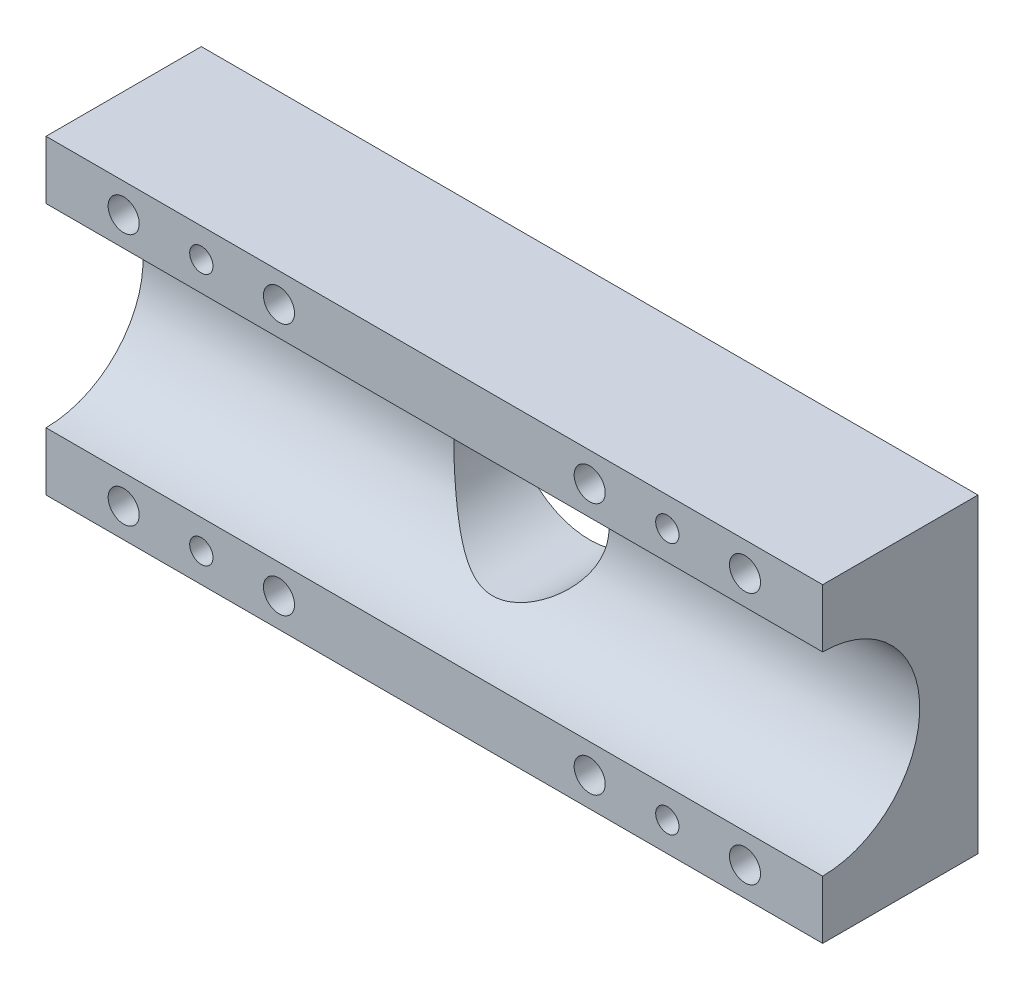
ISO-10303-21;
HEADER;
FILE_DESCRIPTION(('STEP AP214'),'2;1');
FILE_NAME('part.step','',(''),(''),'','','');
FILE_SCHEMA(('AUTOMOTIVE_DESIGN { 1 0 10303 214 1 1 1 1 }'));
ENDSEC;
DATA;
#1=APPLICATION_CONTEXT('core data for automotive mechanical design processes');
#2=APPLICATION_PROTOCOL_DEFINITION('international standard','automotive_design',2000,#1);
#3=PRODUCT_CONTEXT('',#1,'mechanical');
#4=PRODUCT('Part','Part','',(#3));
#5=PRODUCT_RELATED_PRODUCT_CATEGORY('part','',(#4));
#6=PRODUCT_DEFINITION_FORMATION('','',#4);
#7=PRODUCT_DEFINITION_CONTEXT('part definition',#1,'design');
#8=PRODUCT_DEFINITION('design','',#6,#7);
#9=PRODUCT_DEFINITION_SHAPE('','',#8);
#10=(LENGTH_UNIT() NAMED_UNIT(*) SI_UNIT(.MILLI.,.METRE.));
#11=(NAMED_UNIT(*) PLANE_ANGLE_UNIT() SI_UNIT($,.RADIAN.));
#12=(NAMED_UNIT(*) SI_UNIT($,.STERADIAN.) SOLID_ANGLE_UNIT());
#13=UNCERTAINTY_MEASURE_WITH_UNIT(LENGTH_MEASURE(1.E-05),#10,'distance_accuracy_value','');
#14=(GEOMETRIC_REPRESENTATION_CONTEXT(3) GLOBAL_UNCERTAINTY_ASSIGNED_CONTEXT((#13)) GLOBAL_UNIT_ASSIGNED_CONTEXT((#10,
#11,#12)) REPRESENTATION_CONTEXT('',''));
#15=CARTESIAN_POINT('',(0.,0.,0.));
#16=DIRECTION('',(0.,0.,1.));
#17=DIRECTION('',(1.,0.,0.));
#18=AXIS2_PLACEMENT_3D('',#15,#16,#17);
#19=CARTESIAN_POINT('',(0.,0.,20.));
#20=DIRECTION('',(0.,0.,1.));
#21=DIRECTION('',(1.,0.,0.));
#22=AXIS2_PLACEMENT_3D('',#19,#20,#21);
#23=PLANE('',#22);
#24=CARTESIAN_POINT('',(-40.,-16.25,20.));
#25=DIRECTION('',(0.,0.,1.));
#26=DIRECTION('',(1.,0.,0.));
#27=AXIS2_PLACEMENT_3D('',#24,#25,#26);
#28=CIRCLE('',#27,2.);
#29=CARTESIAN_POINT('',(-38.,-16.25,20.));
#30=VERTEX_POINT('',#29);
#31=EDGE_CURVE('E268',#30,#30,#28,.T.);
#32=ORIENTED_EDGE('',*,*,#31,.F.);
#33=EDGE_LOOP('',(#32));
#34=FACE_BOUND('',#33,.T.);
#35=CARTESIAN_POINT('',(-30.,-16.25,20.));
#36=DIRECTION('',(0.,0.,1.));
#37=DIRECTION('',(1.,0.,0.));
#38=AXIS2_PLACEMENT_3D('',#35,#36,#37);
#39=CIRCLE('',#38,1.5);
#40=CARTESIAN_POINT('',(-28.5,-16.25,20.));
#41=VERTEX_POINT('',#40);
#42=EDGE_CURVE('E264',#41,#41,#39,.T.);
#43=ORIENTED_EDGE('',*,*,#42,.F.);
#44=EDGE_LOOP('',(#43));
#45=FACE_BOUND('',#44,.T.);
#46=CARTESIAN_POINT('',(-20.,-16.25,20.));
#47=DIRECTION('',(0.,0.,1.));
#48=DIRECTION('',(1.,0.,0.));
#49=AXIS2_PLACEMENT_3D('',#46,#47,#48);
#50=CIRCLE('',#49,2.);
#51=CARTESIAN_POINT('',(-18.,-16.25,20.));
#52=VERTEX_POINT('',#51);
#53=EDGE_CURVE('E260',#52,#52,#50,.T.);
#54=ORIENTED_EDGE('',*,*,#53,.F.);
#55=EDGE_LOOP('',(#54));
#56=FACE_BOUND('',#55,.T.);
#57=CARTESIAN_POINT('',(20.,-16.25,20.));
#58=DIRECTION('',(0.,0.,1.));
#59=DIRECTION('',(1.,0.,0.));
#60=AXIS2_PLACEMENT_3D('',#57,#58,#59);
#61=CIRCLE('',#60,2.);
#62=CARTESIAN_POINT('',(22.,-16.25,20.));
#63=VERTEX_POINT('',#62);
#64=EDGE_CURVE('E256',#63,#63,#61,.T.);
#65=ORIENTED_EDGE('',*,*,#64,.F.);
#66=EDGE_LOOP('',(#65));
#67=FACE_BOUND('',#66,.T.);
#68=CARTESIAN_POINT('',(30.,-16.25,20.));
#69=DIRECTION('',(0.,0.,1.));
#70=DIRECTION('',(1.,0.,0.));
#71=AXIS2_PLACEMENT_3D('',#68,#69,#70);
#72=CIRCLE('',#71,1.5);
#73=CARTESIAN_POINT('',(31.5,-16.25,20.));
#74=VERTEX_POINT('',#73);
#75=EDGE_CURVE('E252',#74,#74,#72,.T.);
#76=ORIENTED_EDGE('',*,*,#75,.F.);
#77=EDGE_LOOP('',(#76));
#78=FACE_BOUND('',#77,.T.);
#79=CARTESIAN_POINT('',(40.,-16.25,20.));
#80=DIRECTION('',(0.,0.,1.));
#81=DIRECTION('',(1.,0.,0.));
#82=AXIS2_PLACEMENT_3D('',#79,#80,#81);
#83=CIRCLE('',#82,2.);
#84=CARTESIAN_POINT('',(42.,-16.25,20.));
#85=VERTEX_POINT('',#84);
#86=EDGE_CURVE('E248',#85,#85,#83,.T.);
#87=ORIENTED_EDGE('',*,*,#86,.F.);
#88=EDGE_LOOP('',(#87));
#89=FACE_BOUND('',#88,.T.);
#90=DIRECTION('',(1.,0.,0.));
#91=VECTOR('',#90,1.);
#92=CARTESIAN_POINT('',(-50.,-12.5,20.));
#93=LINE('',#92,#91);
#94=CARTESIAN_POINT('',(-50.,-12.5,20.));
#95=VERTEX_POINT('',#94);
#96=CARTESIAN_POINT('',(50.,-12.5,20.));
#97=VERTEX_POINT('',#96);
#98=EDGE_CURVE('E11',#95,#97,#93,.T.);
#99=ORIENTED_EDGE('',*,*,#98,.F.);
#100=DIRECTION('',(0.,-1.,0.));
#101=VECTOR('',#100,1.);
#102=CARTESIAN_POINT('',(-50.,20.,20.));
#103=LINE('',#102,#101);
#104=CARTESIAN_POINT('',(-50.,-20.,20.));
#105=VERTEX_POINT('',#104);
#106=EDGE_CURVE('E109',#95,#105,#103,.T.);
#107=ORIENTED_EDGE('',*,*,#106,.T.);
#108=DIRECTION('',(1.,0.,0.));
#109=VECTOR('',#108,1.);
#110=CARTESIAN_POINT('',(-50.,-20.,20.));
#111=LINE('',#110,#109);
#112=CARTESIAN_POINT('',(50.,-20.,20.));
#113=VERTEX_POINT('',#112);
#114=EDGE_CURVE('E60',#105,#113,#111,.T.);
#115=ORIENTED_EDGE('',*,*,#114,.T.);
#116=DIRECTION('',(0.,1.,0.));
#117=VECTOR('',#116,1.);
#118=CARTESIAN_POINT('',(50.,20.,20.));
#119=LINE('',#118,#117);
#120=EDGE_CURVE('E103',#113,#97,#119,.T.);
#121=ORIENTED_EDGE('',*,*,#120,.T.);
#122=EDGE_LOOP('',(#99,#107,#115,#121));
#123=FACE_BOUND('',#122,.T.);
#124=ADVANCED_FACE('F32',(#34,#45,#56,#67,#78,#89,#123),#23,.T.);
#125=CARTESIAN_POINT('',(50.,20.,20.));
#126=DIRECTION('',(-1.,0.,0.));
#127=DIRECTION('',(0.,-1.,0.));
#128=AXIS2_PLACEMENT_3D('',#125,#126,#127);
#129=PLANE('',#128);
#130=CARTESIAN_POINT('',(50.,12.5,20.));
#131=VERTEX_POINT('',#130);
#132=CARTESIAN_POINT('',(50.,20.,20.));
#133=VERTEX_POINT('',#132);
#134=EDGE_CURVE('E88',#131,#133,#119,.T.);
#135=ORIENTED_EDGE('',*,*,#134,.F.);
#136=CARTESIAN_POINT('',(50.,0.,20.));
#137=DIRECTION('',(1.,0.,0.));
#138=DIRECTION('',(0.,1.,0.));
#139=AXIS2_PLACEMENT_3D('',#136,#137,#138);
#140=CIRCLE('',#139,12.5);
#141=EDGE_CURVE('E51',#97,#131,#140,.T.);
#142=ORIENTED_EDGE('',*,*,#141,.F.);
#143=ORIENTED_EDGE('',*,*,#120,.F.);
#144=DIRECTION('',(0.,0.,-1.));
#145=VECTOR('',#144,1.);
#146=CARTESIAN_POINT('',(50.,-20.,20.));
#147=LINE('',#146,#145);
#148=CARTESIAN_POINT('',(50.,-20.,0.));
#149=VERTEX_POINT('',#148);
#150=EDGE_CURVE('E117',#113,#149,#147,.T.);
#151=ORIENTED_EDGE('',*,*,#150,.T.);
#152=DIRECTION('',(0.,1.,0.));
#153=VECTOR('',#152,1.);
#154=CARTESIAN_POINT('',(50.,20.,0.));
#155=LINE('',#154,#153);
#156=CARTESIAN_POINT('',(50.,20.,0.));
#157=VERTEX_POINT('',#156);
#158=EDGE_CURVE('E118',#149,#157,#155,.T.);
#159=ORIENTED_EDGE('',*,*,#158,.T.);
#160=DIRECTION('',(0.,0.,-1.));
#161=VECTOR('',#160,1.);
#162=CARTESIAN_POINT('',(50.,20.,20.));
#163=LINE('',#162,#161);
#164=EDGE_CURVE('E132',#133,#157,#163,.T.);
#165=ORIENTED_EDGE('',*,*,#164,.F.);
#166=EDGE_LOOP('',(#135,#142,#143,#151,#159,#165));
#167=FACE_BOUND('',#166,.T.);
#168=ADVANCED_FACE('F34',(#167),#129,.F.);
#169=CARTESIAN_POINT('',(-50.,20.,20.));
#170=DIRECTION('',(0.,-1.,0.));
#171=DIRECTION('',(0.,0.,-1.));
#172=AXIS2_PLACEMENT_3D('',#169,#170,#171);
#173=PLANE('',#172);
#174=DIRECTION('',(-1.,0.,0.));
#175=VECTOR('',#174,1.);
#176=CARTESIAN_POINT('',(-50.,20.,0.));
#177=LINE('',#176,#175);
#178=CARTESIAN_POINT('',(-50.,20.,0.));
#179=VERTEX_POINT('',#178);
#180=EDGE_CURVE('E121',#157,#179,#177,.T.);
#181=ORIENTED_EDGE('',*,*,#180,.T.);
#182=DIRECTION('',(0.,0.,-1.));
#183=VECTOR('',#182,1.);
#184=CARTESIAN_POINT('',(-50.,20.,20.));
#185=LINE('',#184,#183);
#186=CARTESIAN_POINT('',(-50.,20.,20.));
#187=VERTEX_POINT('',#186);
#188=EDGE_CURVE('E129',#187,#179,#185,.T.);
#189=ORIENTED_EDGE('',*,*,#188,.F.);
#190=DIRECTION('',(-1.,0.,0.));
#191=VECTOR('',#190,1.);
#192=CARTESIAN_POINT('',(-50.,20.,20.));
#193=LINE('',#192,#191);
#194=EDGE_CURVE('E107',#133,#187,#193,.T.);
#195=ORIENTED_EDGE('',*,*,#194,.F.);
#196=ORIENTED_EDGE('',*,*,#164,.T.);
#197=EDGE_LOOP('',(#181,#189,#195,#196));
#198=FACE_BOUND('',#197,.T.);
#199=ADVANCED_FACE('F142',(#198),#173,.F.);
#200=CARTESIAN_POINT('',(-50.,20.,20.));
#201=DIRECTION('',(1.,0.,0.));
#202=DIRECTION('',(0.,1.,0.));
#203=AXIS2_PLACEMENT_3D('',#200,#201,#202);
#204=PLANE('',#203);
#205=ORIENTED_EDGE('',*,*,#106,.F.);
#206=CARTESIAN_POINT('',(-50.,0.,20.));
#207=DIRECTION('',(1.,0.,0.));
#208=DIRECTION('',(0.,1.,0.));
#209=AXIS2_PLACEMENT_3D('',#206,#207,#208);
#210=CIRCLE('',#209,12.5);
#211=CARTESIAN_POINT('',(-50.,12.5,20.));
#212=VERTEX_POINT('',#211);
#213=EDGE_CURVE('E99',#95,#212,#210,.T.);
#214=ORIENTED_EDGE('',*,*,#213,.T.);
#215=EDGE_CURVE('E113',#187,#212,#103,.T.);
#216=ORIENTED_EDGE('',*,*,#215,.F.);
#217=ORIENTED_EDGE('',*,*,#188,.T.);
#218=DIRECTION('',(0.,-1.,0.));
#219=VECTOR('',#218,1.);
#220=CARTESIAN_POINT('',(-50.,20.,0.));
#221=LINE('',#220,#219);
#222=CARTESIAN_POINT('',(-50.,-20.,0.));
#223=VERTEX_POINT('',#222);
#224=EDGE_CURVE('E123',#179,#223,#221,.T.);
#225=ORIENTED_EDGE('',*,*,#224,.T.);
#226=DIRECTION('',(0.,0.,-1.));
#227=VECTOR('',#226,1.);
#228=CARTESIAN_POINT('',(-50.,-20.,20.));
#229=LINE('',#228,#227);
#230=EDGE_CURVE('E127',#105,#223,#229,.T.);
#231=ORIENTED_EDGE('',*,*,#230,.F.);
#232=EDGE_LOOP('',(#205,#214,#216,#217,#225,#231));
#233=FACE_BOUND('',#232,.T.);
#234=ADVANCED_FACE('F137',(#233),#204,.F.);
#235=CARTESIAN_POINT('',(-50.,-20.,20.));
#236=DIRECTION('',(0.,1.,0.));
#237=DIRECTION('',(0.,0.,1.));
#238=AXIS2_PLACEMENT_3D('',#235,#236,#237);
#239=PLANE('',#238);
#240=DIRECTION('',(1.,0.,0.));
#241=VECTOR('',#240,1.);
#242=CARTESIAN_POINT('',(-50.,-20.,0.));
#243=LINE('',#242,#241);
#244=EDGE_CURVE('E81',#223,#149,#243,.T.);
#245=ORIENTED_EDGE('',*,*,#244,.T.);
#246=ORIENTED_EDGE('',*,*,#150,.F.);
#247=ORIENTED_EDGE('',*,*,#114,.F.);
#248=ORIENTED_EDGE('',*,*,#230,.T.);
#249=EDGE_LOOP('',(#245,#246,#247,#248));
#250=FACE_BOUND('',#249,.T.);
#251=ADVANCED_FACE('F147',(#250),#239,.F.);
#252=CARTESIAN_POINT('',(40.,16.25,20.));
#253=DIRECTION('',(0.,0.,1.));
#254=DIRECTION('',(1.,0.,0.));
#255=AXIS2_PLACEMENT_3D('',#252,#253,#254);
#256=CIRCLE('',#255,2.);
#257=CARTESIAN_POINT('',(42.,16.25,20.));
#258=VERTEX_POINT('',#257);
#259=EDGE_CURVE('E244',#258,#258,#256,.T.);
#260=ORIENTED_EDGE('',*,*,#259,.F.);
#261=EDGE_LOOP('',(#260));
#262=FACE_BOUND('',#261,.T.);
#263=CARTESIAN_POINT('',(30.,16.25,20.));
#264=DIRECTION('',(0.,0.,1.));
#265=DIRECTION('',(1.,0.,0.));
#266=AXIS2_PLACEMENT_3D('',#263,#264,#265);
#267=CIRCLE('',#266,1.5);
#268=CARTESIAN_POINT('',(31.5,16.25,20.));
#269=VERTEX_POINT('',#268);
#270=EDGE_CURVE('E240',#269,#269,#267,.T.);
#271=ORIENTED_EDGE('',*,*,#270,.F.);
#272=EDGE_LOOP('',(#271));
#273=FACE_BOUND('',#272,.T.);
#274=CARTESIAN_POINT('',(20.,16.25,20.));
#275=DIRECTION('',(0.,0.,1.));
#276=DIRECTION('',(1.,0.,0.));
#277=AXIS2_PLACEMENT_3D('',#274,#275,#276);
#278=CIRCLE('',#277,2.00000000000001);
#279=CARTESIAN_POINT('',(22.,16.25,20.));
#280=VERTEX_POINT('',#279);
#281=EDGE_CURVE('E236',#280,#280,#278,.T.);
#282=ORIENTED_EDGE('',*,*,#281,.F.);
#283=EDGE_LOOP('',(#282));
#284=FACE_BOUND('',#283,.T.);
#285=CARTESIAN_POINT('',(-20.,16.25,20.));
#286=DIRECTION('',(0.,0.,1.));
#287=DIRECTION('',(1.,0.,0.));
#288=AXIS2_PLACEMENT_3D('',#285,#286,#287);
#289=CIRCLE('',#288,2.);
#290=CARTESIAN_POINT('',(-18.,16.25,20.));
#291=VERTEX_POINT('',#290);
#292=EDGE_CURVE('E232',#291,#291,#289,.T.);
#293=ORIENTED_EDGE('',*,*,#292,.F.);
#294=EDGE_LOOP('',(#293));
#295=FACE_BOUND('',#294,.T.);
#296=CARTESIAN_POINT('',(-30.,16.25,20.));
#297=DIRECTION('',(0.,0.,1.));
#298=DIRECTION('',(1.,0.,0.));
#299=AXIS2_PLACEMENT_3D('',#296,#297,#298);
#300=CIRCLE('',#299,1.5);
#301=CARTESIAN_POINT('',(-28.5,16.25,20.));
#302=VERTEX_POINT('',#301);
#303=EDGE_CURVE('E228',#302,#302,#300,.T.);
#304=ORIENTED_EDGE('',*,*,#303,.F.);
#305=EDGE_LOOP('',(#304));
#306=FACE_BOUND('',#305,.T.);
#307=CARTESIAN_POINT('',(-40.,16.25,20.));
#308=DIRECTION('',(0.,0.,1.));
#309=DIRECTION('',(1.,0.,0.));
#310=AXIS2_PLACEMENT_3D('',#307,#308,#309);
#311=CIRCLE('',#310,2.);
#312=CARTESIAN_POINT('',(-38.,16.25,20.));
#313=VERTEX_POINT('',#312);
#314=EDGE_CURVE('E225',#313,#313,#311,.T.);
#315=ORIENTED_EDGE('',*,*,#314,.F.);
#316=EDGE_LOOP('',(#315));
#317=FACE_BOUND('',#316,.T.);
#318=DIRECTION('',(1.,0.,0.));
#319=VECTOR('',#318,1.);
#320=CARTESIAN_POINT('',(-50.,12.5,20.));
#321=LINE('',#320,#319);
#322=EDGE_CURVE('E45',#131,#212,#321,.F.);
#323=ORIENTED_EDGE('',*,*,#322,.F.);
#324=ORIENTED_EDGE('',*,*,#134,.T.);
#325=ORIENTED_EDGE('',*,*,#194,.T.);
#326=ORIENTED_EDGE('',*,*,#215,.T.);
#327=EDGE_LOOP('',(#323,#324,#325,#326));
#328=FACE_BOUND('',#327,.T.);
#329=ADVANCED_FACE('F139',(#262,#273,#284,#295,#306,#317,#328),#23,.T.);
#330=CARTESIAN_POINT('',(0.,0.,0.));
#331=DIRECTION('',(0.,0.,1.));
#332=DIRECTION('',(1.,0.,0.));
#333=AXIS2_PLACEMENT_3D('',#330,#331,#332);
#334=PLANE('',#333);
#335=CARTESIAN_POINT('',(0.,0.,0.));
#336=DIRECTION('',(0.,0.,-1.));
#337=DIRECTION('',(-1.,0.,0.));
#338=AXIS2_PLACEMENT_3D('',#335,#336,#337);
#339=CIRCLE('',#338,10.);
#340=CARTESIAN_POINT('',(-10.,0.,0.));
#341=VERTEX_POINT('',#340);
#342=EDGE_CURVE('E177',#341,#341,#339,.T.);
#343=ORIENTED_EDGE('',*,*,#342,.F.);
#344=EDGE_LOOP('',(#343));
#345=FACE_BOUND('',#344,.T.);
#346=CARTESIAN_POINT('',(-40.,-16.25,0.));
#347=DIRECTION('',(0.,0.,1.));
#348=DIRECTION('',(1.,0.,0.));
#349=AXIS2_PLACEMENT_3D('',#346,#347,#348);
#350=CIRCLE('',#349,2.);
#351=CARTESIAN_POINT('',(-38.,-16.25,0.));
#352=VERTEX_POINT('',#351);
#353=EDGE_CURVE('E181',#352,#352,#350,.T.);
#354=ORIENTED_EDGE('',*,*,#353,.T.);
#355=EDGE_LOOP('',(#354));
#356=FACE_BOUND('',#355,.T.);
#357=CARTESIAN_POINT('',(-30.,-16.25,0.));
#358=DIRECTION('',(0.,0.,1.));
#359=DIRECTION('',(1.,0.,0.));
#360=AXIS2_PLACEMENT_3D('',#357,#358,#359);
#361=CIRCLE('',#360,1.5);
#362=CARTESIAN_POINT('',(-28.5,-16.25,0.));
#363=VERTEX_POINT('',#362);
#364=EDGE_CURVE('E185',#363,#363,#361,.T.);
#365=ORIENTED_EDGE('',*,*,#364,.T.);
#366=EDGE_LOOP('',(#365));
#367=FACE_BOUND('',#366,.T.);
#368=CARTESIAN_POINT('',(-20.,-16.25,0.));
#369=DIRECTION('',(0.,0.,1.));
#370=DIRECTION('',(1.,0.,0.));
#371=AXIS2_PLACEMENT_3D('',#368,#369,#370);
#372=CIRCLE('',#371,2.);
#373=CARTESIAN_POINT('',(-18.,-16.25,0.));
#374=VERTEX_POINT('',#373);
#375=EDGE_CURVE('E189',#374,#374,#372,.T.);
#376=ORIENTED_EDGE('',*,*,#375,.T.);
#377=EDGE_LOOP('',(#376));
#378=FACE_BOUND('',#377,.T.);
#379=CARTESIAN_POINT('',(20.,-16.25,0.));
#380=DIRECTION('',(0.,0.,1.));
#381=DIRECTION('',(1.,0.,0.));
#382=AXIS2_PLACEMENT_3D('',#379,#380,#381);
#383=CIRCLE('',#382,2.);
#384=CARTESIAN_POINT('',(22.,-16.25,0.));
#385=VERTEX_POINT('',#384);
#386=EDGE_CURVE('E193',#385,#385,#383,.T.);
#387=ORIENTED_EDGE('',*,*,#386,.T.);
#388=EDGE_LOOP('',(#387));
#389=FACE_BOUND('',#388,.T.);
#390=CARTESIAN_POINT('',(30.,-16.25,0.));
#391=DIRECTION('',(0.,0.,1.));
#392=DIRECTION('',(1.,0.,0.));
#393=AXIS2_PLACEMENT_3D('',#390,#391,#392);
#394=CIRCLE('',#393,1.5);
#395=CARTESIAN_POINT('',(31.5,-16.25,0.));
#396=VERTEX_POINT('',#395);
#397=EDGE_CURVE('E197',#396,#396,#394,.T.);
#398=ORIENTED_EDGE('',*,*,#397,.T.);
#399=EDGE_LOOP('',(#398));
#400=FACE_BOUND('',#399,.T.);
#401=CARTESIAN_POINT('',(40.,-16.25,0.));
#402=DIRECTION('',(0.,0.,1.));
#403=DIRECTION('',(1.,0.,0.));
#404=AXIS2_PLACEMENT_3D('',#401,#402,#403);
#405=CIRCLE('',#404,2.);
#406=CARTESIAN_POINT('',(42.,-16.25,0.));
#407=VERTEX_POINT('',#406);
#408=EDGE_CURVE('E201',#407,#407,#405,.T.);
#409=ORIENTED_EDGE('',*,*,#408,.T.);
#410=EDGE_LOOP('',(#409));
#411=FACE_BOUND('',#410,.T.);
#412=CARTESIAN_POINT('',(40.,16.25,0.));
#413=DIRECTION('',(0.,0.,1.));
#414=DIRECTION('',(1.,0.,0.));
#415=AXIS2_PLACEMENT_3D('',#412,#413,#414);
#416=CIRCLE('',#415,2.);
#417=CARTESIAN_POINT('',(42.,16.25,0.));
#418=VERTEX_POINT('',#417);
#419=EDGE_CURVE('E205',#418,#418,#416,.T.);
#420=ORIENTED_EDGE('',*,*,#419,.T.);
#421=EDGE_LOOP('',(#420));
#422=FACE_BOUND('',#421,.T.);
#423=CARTESIAN_POINT('',(30.,16.25,0.));
#424=DIRECTION('',(0.,0.,1.));
#425=DIRECTION('',(1.,0.,0.));
#426=AXIS2_PLACEMENT_3D('',#423,#424,#425);
#427=CIRCLE('',#426,1.5);
#428=CARTESIAN_POINT('',(31.5,16.25,0.));
#429=VERTEX_POINT('',#428);
#430=EDGE_CURVE('E209',#429,#429,#427,.T.);
#431=ORIENTED_EDGE('',*,*,#430,.T.);
#432=EDGE_LOOP('',(#431));
#433=FACE_BOUND('',#432,.T.);
#434=CARTESIAN_POINT('',(20.,16.25,0.));
#435=DIRECTION('',(0.,0.,1.));
#436=DIRECTION('',(1.,0.,0.));
#437=AXIS2_PLACEMENT_3D('',#434,#435,#436);
#438=CIRCLE('',#437,2.00000000000001);
#439=CARTESIAN_POINT('',(22.,16.25,0.));
#440=VERTEX_POINT('',#439);
#441=EDGE_CURVE('E213',#440,#440,#438,.T.);
#442=ORIENTED_EDGE('',*,*,#441,.T.);
#443=EDGE_LOOP('',(#442));
#444=FACE_BOUND('',#443,.T.);
#445=CARTESIAN_POINT('',(-20.,16.25,0.));
#446=DIRECTION('',(0.,0.,1.));
#447=DIRECTION('',(1.,0.,0.));
#448=AXIS2_PLACEMENT_3D('',#445,#446,#447);
#449=CIRCLE('',#448,2.);
#450=CARTESIAN_POINT('',(-18.,16.25,0.));
#451=VERTEX_POINT('',#450);
#452=EDGE_CURVE('E217',#451,#451,#449,.T.);
#453=ORIENTED_EDGE('',*,*,#452,.T.);
#454=EDGE_LOOP('',(#453));
#455=FACE_BOUND('',#454,.T.);
#456=CARTESIAN_POINT('',(-30.,16.25,0.));
#457=DIRECTION('',(0.,0.,1.));
#458=DIRECTION('',(1.,0.,0.));
#459=AXIS2_PLACEMENT_3D('',#456,#457,#458);
#460=CIRCLE('',#459,1.5);
#461=CARTESIAN_POINT('',(-28.5,16.25,0.));
#462=VERTEX_POINT('',#461);
#463=EDGE_CURVE('E221',#462,#462,#460,.T.);
#464=ORIENTED_EDGE('',*,*,#463,.T.);
#465=EDGE_LOOP('',(#464));
#466=FACE_BOUND('',#465,.T.);
#467=CARTESIAN_POINT('',(-40.,16.25,0.));
#468=DIRECTION('',(0.,0.,1.));
#469=DIRECTION('',(1.,0.,0.));
#470=AXIS2_PLACEMENT_3D('',#467,#468,#469);
#471=CIRCLE('',#470,2.);
#472=CARTESIAN_POINT('',(-38.,16.25,0.));
#473=VERTEX_POINT('',#472);
#474=EDGE_CURVE('E105',#473,#473,#471,.T.);
#475=ORIENTED_EDGE('',*,*,#474,.T.);
#476=EDGE_LOOP('',(#475));
#477=FACE_BOUND('',#476,.T.);
#478=ORIENTED_EDGE('',*,*,#158,.F.);
#479=ORIENTED_EDGE('',*,*,#244,.F.);
#480=ORIENTED_EDGE('',*,*,#224,.F.);
#481=ORIENTED_EDGE('',*,*,#180,.F.);
#482=EDGE_LOOP('',(#478,#479,#480,#481));
#483=FACE_BOUND('',#482,.T.);
#484=ADVANCED_FACE('F146',(#345,#356,#367,#378,#389,#400,#411,#422,#433,#444,#455,#466,#477,
#483),#334,.F.);
#485=CARTESIAN_POINT('',(-50.,0.,20.));
#486=DIRECTION('',(1.,0.,0.));
#487=DIRECTION('',(0.,1.,0.));
#488=AXIS2_PLACEMENT_3D('',#485,#486,#487);
#489=CYLINDRICAL_SURFACE('',#488,12.5);
#490=CARTESIAN_POINT('',(-10.,0.,7.5));
#491=CARTESIAN_POINT('',(-9.99999804390816,0.240115494021913,7.50000190737019));
#492=CARTESIAN_POINT('',(-9.99133618041698,0.480267914709254,7.50693438388104));
#493=CARTESIAN_POINT('',(-9.95683501917429,0.958643420730859,7.53450928344761));
#494=CARTESIAN_POINT('',(-9.93098663098572,1.19686541747935,7.55515896191248));
#495=CARTESIAN_POINT('',(-9.86250639230357,1.66977619191157,7.60973753393555));
#496=CARTESIAN_POINT('',(-9.81984442144614,1.90445783957156,7.64369025833442));
#497=CARTESIAN_POINT('',(-9.71844838249671,2.36814257602141,7.7241176814116));
#498=CARTESIAN_POINT('',(-9.65971233862597,2.59714496295652,7.77059391943332));
#499=CARTESIAN_POINT('',(-9.52750069310951,3.04651150458968,7.87475264751988));
#500=CARTESIAN_POINT('',(-9.4541237905209,3.26692228211059,7.93236002072766));
#501=CARTESIAN_POINT('',(-9.29337184301657,3.69952641652756,8.0578796195868));
#502=CARTESIAN_POINT('',(-9.20599671056704,3.91171972202777,8.1257919096768));
#503=CARTESIAN_POINT('',(-9.01827264075418,4.32696989557638,8.2707339094155));
#504=CARTESIAN_POINT('',(-8.91792678077107,4.53002891543156,8.34776145605167));
#505=CARTESIAN_POINT('',(-8.70520597665731,4.92646048711897,8.50974930473881));
#506=CARTESIAN_POINT('',(-8.59282887684002,5.11983129393237,8.59471102803924));
#507=CARTESIAN_POINT('',(-8.31585437343792,5.56204188454174,8.80212956032213));
#508=CARTESIAN_POINT('',(-8.14669920547367,5.8067499020995,8.92734080583711));
#509=CARTESIAN_POINT('',(-7.79003492295404,6.27714455933199,9.1870590270876));
#510=CARTESIAN_POINT('',(-7.60251994592129,6.50282508023772,9.32156896793636));
#511=CARTESIAN_POINT('',(-7.21012080482888,6.93539186387582,9.59729430315217));
#512=CARTESIAN_POINT('',(-7.00519186711206,7.14222666112357,9.73852654511249));
#513=CARTESIAN_POINT('',(-6.57945986411342,7.53623502050492,10.0243105443664));
#514=CARTESIAN_POINT('',(-6.3586586059258,7.72341081490081,10.1688619224986));
#515=CARTESIAN_POINT('',(-5.89814837271719,8.08072482806858,10.4603015244149));
#516=CARTESIAN_POINT('',(-5.65819760393934,8.25055062784373,10.607190921931));
#517=CARTESIAN_POINT('',(-5.16254284616452,8.56942488179742,10.8971765153941));
#518=CARTESIAN_POINT('',(-4.90683391363892,8.71846676747005,11.0402715006438));
#519=CARTESIAN_POINT('',(-4.38017742153268,8.99456293800555,11.3174900057232));
#520=CARTESIAN_POINT('',(-4.10927386215453,9.12167676530126,11.451637193663));
#521=CARTESIAN_POINT('',(-3.551557464042,9.35294537755475,11.7053127024005));
#522=CARTESIAN_POINT('',(-3.26475848211872,9.45711977782143,11.8248534737763));
#523=CARTESIAN_POINT('',(-2.63066297685346,9.65429151778239,12.0582476183489));
#524=CARTESIAN_POINT('',(-2.28072998170622,9.74329311573869,12.1685824368413));
#525=CARTESIAN_POINT('',(-1.74286401613892,9.84864523322286,12.3021171931336));
#526=CARTESIAN_POINT('',(-1.56153824131624,9.87906008238269,12.3412855350152));
#527=CARTESIAN_POINT('',(-1.19535061397237,9.93001773284304,12.407470707665));
#528=CARTESIAN_POINT('',(-1.01049057869337,9.95056547281391,12.4344936170117));
#529=CARTESIAN_POINT('',(-0.636722053249821,9.98148644053064,12.4753338603857));
#530=CARTESIAN_POINT('',(-0.447791963895259,9.9917643242811,12.4890274167811));
#531=CARTESIAN_POINT('',(-0.0691588274468927,10.0015536064685,12.5020672871337));
#532=CARTESIAN_POINT('',(0.12054418104451,10.001065536163,12.5014143090361));
#533=CARTESIAN_POINT('',(0.499154792142549,9.9893314885241,12.4857902554078));
#534=CARTESIAN_POINT('',(0.68806171782345,9.97807770650013,12.4708087923268));
#535=CARTESIAN_POINT('',(1.06337268266153,9.94508663922794,12.4272866100052));
#536=CARTESIAN_POINT('',(1.24977636816285,9.92334788835856,12.3987439951534));
#537=CARTESIAN_POINT('',(1.64768842689767,9.86567799155421,12.3240017159196));
#538=CARTESIAN_POINT('',(1.85856398597591,9.82805900055645,12.2757387807014));
#539=CARTESIAN_POINT('',(2.273947502248,9.74034279473269,12.1654164296636));
#540=CARTESIAN_POINT('',(2.47845407434739,9.69024288664751,12.1033540363678));
#541=CARTESIAN_POINT('',(3.08237300252111,9.52228155570276,11.9001958647725));
#542=CARTESIAN_POINT('',(3.47138251225604,9.38688030820904,11.7422982743284));
#543=CARTESIAN_POINT('',(4.12451938714888,9.11481609401854,11.4442978881857));
#544=CARTESIAN_POINT('',(4.39526807527487,8.9872105031012,11.3098633405348));
#545=CARTESIAN_POINT('',(4.9211066250307,8.71039279230838,11.0324233973331));
#546=CARTESIAN_POINT('',(5.17618917147763,8.56117068636684,10.8894140585259));
#547=CARTESIAN_POINT('',(5.67097231117102,8.24177810095373,10.5994835373353));
#548=CARTESIAN_POINT('',(5.91065457935941,8.07158334324081,10.4525579785643));
#549=CARTESIAN_POINT('',(6.37416728744011,7.71078503777532,10.158866821163));
#550=CARTESIAN_POINT('',(6.59800032398775,7.52018484605572,10.0121012002267));
#551=CARTESIAN_POINT('',(7.03502535516449,7.1133613016757,9.71823250555964));
#552=CARTESIAN_POINT('',(7.24777164199976,6.89658830697581,9.57122572189674));
#553=CARTESIAN_POINT('',(7.65478369405559,6.44184655062954,9.28436235542978));
#554=CARTESIAN_POINT('',(7.84904673355408,6.2038746727749,9.14450682862302));
#555=CARTESIAN_POINT('',(8.21688938719568,5.70770360554156,8.87563185810617));
#556=CARTESIAN_POINT('',(8.39051534503476,5.44955198184014,8.74658833452825));
#557=CARTESIAN_POINT('',(8.71532687912939,4.91337047703461,8.50237128944027));
#558=CARTESIAN_POINT('',(8.8665225826791,4.63534965143735,8.38719151288581));
#559=CARTESIAN_POINT('',(9.10401110315496,4.14350613363762,8.20470272607828));
#560=CARTESIAN_POINT('',(9.19646577691995,3.93420860434023,8.13315157648186));
#561=CARTESIAN_POINT('',(9.367683993761,3.50705091985966,7.99997479686794));
#562=CARTESIAN_POINT('',(9.44645093476862,3.28919290629956,7.93834670376629));
#563=CARTESIAN_POINT('',(9.58927616120017,2.84604090783996,7.82616472944295));
#564=CARTESIAN_POINT('',(9.65334175587869,2.62075068211275,7.77560534562815));
#565=CARTESIAN_POINT('',(9.765891535553,2.16395185541762,7.68653367124926));
#566=CARTESIAN_POINT('',(9.81437531558593,1.93244309300273,7.6480216937914));
#567=CARTESIAN_POINT('',(9.89519098149735,1.46358368540258,7.5837122467449));
#568=CARTESIAN_POINT('',(9.9274361950175,1.22620864128057,7.55798301388815));
#569=CARTESIAN_POINT('',(9.97482120641661,0.748671184713255,7.52014206320611));
#570=CARTESIAN_POINT('',(9.98996103286722,0.508508776924454,7.50803032263512));
#571=CARTESIAN_POINT('',(10.0028563243367,0.0274521590046514,7.49771542003466));
#572=CARTESIAN_POINT('',(10.0006142492373,-0.213441942754031,7.49951028994568));
#573=CARTESIAN_POINT('',(9.97879216629179,-0.69392748791632,7.51696152212725));
#574=CARTESIAN_POINT('',(9.95921304511511,-0.933518997307982,7.53261717551512));
#575=CARTESIAN_POINT('',(9.90536528565652,-1.39003528500963,7.57558759532138));
#576=CARTESIAN_POINT('',(9.87242150016806,-1.60721816358795,7.60185005653474));
#577=CARTESIAN_POINT('',(9.79267866885968,-2.03748146009256,7.66525353690269));
#578=CARTESIAN_POINT('',(9.74587495246923,-2.25056046926117,7.70239822314444));
#579=CARTESIAN_POINT('',(9.63905914942394,-2.67126133441773,7.78687616263369));
#580=CARTESIAN_POINT('',(9.57904933323538,-2.87888412160944,7.83420766447635));
#581=CARTESIAN_POINT('',(9.44652707354461,-3.28775535237349,7.93827579728574));
#582=CARTESIAN_POINT('',(9.37400977842957,-3.48900128639261,7.99501607755813));
#583=CARTESIAN_POINT('',(9.21245971430719,-3.89634380818415,8.12074562781332));
#584=CARTESIAN_POINT('',(9.12268648276475,-4.1019800593664,8.19027293820033));
#585=CARTESIAN_POINT('',(8.93086476830836,-4.50437150450408,8.33781378710792));
#586=CARTESIAN_POINT('',(8.82881128305631,-4.70112303409784,8.41583078263913));
#587=CARTESIAN_POINT('',(8.61339738914654,-5.08505889124567,8.57915577817025));
#588=CARTESIAN_POINT('',(8.50004094118727,-5.27224653557218,8.66446122271782));
#589=CARTESIAN_POINT('',(8.26280430878379,-5.63678729554489,8.8412510385149));
#590=CARTESIAN_POINT('',(8.1389226821126,-5.81413905789517,8.93273625620314));
#591=CARTESIAN_POINT('',(7.85698263742762,-6.19138766418694,9.1385450175888));
#592=CARTESIAN_POINT('',(7.69689330482162,-6.38919867506118,9.25391397804578));
#593=CARTESIAN_POINT('',(7.36389980644543,-6.77030400771425,9.48985189778718));
#594=CARTESIAN_POINT('',(7.19099719890008,-6.95360008906669,9.61042022403259));
#595=CARTESIAN_POINT('',(6.83256153556447,-7.30612645144452,9.85521347600292));
#596=CARTESIAN_POINT('',(6.6469921238197,-7.47531285828042,9.97944829165689));
#597=CARTESIAN_POINT('',(6.26423571986984,-7.79885473186264,10.2291443700005));
#598=CARTESIAN_POINT('',(6.06705136460507,-7.95321354414189,10.3546053489606));
#599=CARTESIAN_POINT('',(5.61789564476637,-8.27838805014752,10.6312738831631));
#600=CARTESIAN_POINT('',(5.3632180070507,-8.44567681696493,10.7822570351396));
#601=CARTESIAN_POINT('',(4.8368677217767,-8.75776037293854,11.0782350098998));
#602=CARTESIAN_POINT('',(4.56518616511671,-8.90254322950633,11.2232266262779));
#603=CARTESIAN_POINT('',(4.00556970516512,-9.16793392891864,11.5008405226413));
#604=CARTESIAN_POINT('',(3.71769546087089,-9.28862517709992,11.6335045967661));
#605=CARTESIAN_POINT('',(3.12475459646427,-9.50448201019024,11.8795574732825));
#606=CARTESIAN_POINT('',(2.81970975123468,-9.59967908064901,11.9929699875234));
#607=CARTESIAN_POINT('',(2.33800853815336,-9.72440484419204,12.145654639825));
#608=CARTESIAN_POINT('',(2.16708635930981,-9.76396183934475,12.1949844517141));
#609=CARTESIAN_POINT('',(1.82099843804176,-9.83438451101943,12.2839066851585));
#610=CARTESIAN_POINT('',(1.6458344444937,-9.86525370537986,12.3235030471289));
#611=CARTESIAN_POINT('',(1.29233821854153,-9.91774762321979,12.3914435216202));
#612=CARTESIAN_POINT('',(1.11401340884937,-9.93939161680362,12.4198110805472));
#613=CARTESIAN_POINT('',(0.754914848966485,-9.97309459580926,12.4642075471025));
#614=CARTESIAN_POINT('',(0.574141115141724,-9.98515364525436,12.480236537147));
#615=CARTESIAN_POINT('',(0.210519199739234,-9.99944815504832,12.4992544521445));
#616=CARTESIAN_POINT('',(0.0276650810572954,-10.001629641448,12.5021717301564));
#617=CARTESIAN_POINT('',(-0.33760270776603,-9.99596868103767,12.4946265654486));
#618=CARTESIAN_POINT('',(-0.520016385500288,-9.98812640828392,12.484164355055));
#619=CARTESIAN_POINT('',(-0.883143492837044,-9.96259143366085,12.4503500046661));
#620=CARTESIAN_POINT('',(-1.06385474456778,-9.94488750076744,12.4269831684031));
#621=CARTESIAN_POINT('',(-1.42222717741851,-9.89999588794493,12.368392425995));
#622=CARTESIAN_POINT('',(-1.59988641068895,-9.87280237149052,12.3331612231926));
#623=CARTESIAN_POINT('',(-1.99925178584588,-9.80074805727316,12.2411585527048));
#624=CARTESIAN_POINT('',(-2.2197033249112,-9.75308875910925,12.1811306804248));
#625=CARTESIAN_POINT('',(-2.65297276338152,-9.64425713656235,12.047281821924));
#626=CARTESIAN_POINT('',(-2.86578669553033,-9.58307790421739,11.9734537875433));
#627=CARTESIAN_POINT('',(-3.28374288206829,-9.44803573241938,11.8149234138394));
#628=CARTESIAN_POINT('',(-3.48886618387973,-9.3741436834048,11.7301962327548));
#629=CARTESIAN_POINT('',(-3.89084314152416,-9.21455961386049,11.5527433278774));
#630=CARTESIAN_POINT('',(-4.0876964709879,-9.1288671282038,11.4600172888548));
#631=CARTESIAN_POINT('',(-4.56080430389194,-8.90479138802172,11.2255172251549));
#632=CARTESIAN_POINT('',(-4.83254270270703,-8.76014649184774,11.0805840618905));
#633=CARTESIAN_POINT('',(-5.35922160543728,-8.44822183074572,10.7845859192654));
#634=CARTESIAN_POINT('',(-5.61415521395566,-8.28093285933981,10.6335184634438));
#635=CARTESIAN_POINT('',(-6.10742681282126,-7.92414396341246,10.329793661933));
#636=CARTESIAN_POINT('',(-6.34574877821724,-7.7346230522465,10.1771349399724));
#637=CARTESIAN_POINT('',(-6.80501068838673,-7.3338050495564,9.87436951412885));
#638=CARTESIAN_POINT('',(-7.02595337100087,-7.12251140015847,9.72426241120967));
#639=CARTESIAN_POINT('',(-7.45227002204495,-6.67535305267615,9.42822097231304));
#640=CARTESIAN_POINT('',(-7.65739943352337,-6.43920034217952,9.28236808173315));
#641=CARTESIAN_POINT('',(-8.04715841830217,-5.94493720029606,9.00051568860538));
#642=CARTESIAN_POINT('',(-8.23178458885126,-5.68682313668396,8.86451782291098));
#643=CARTESIAN_POINT('',(-8.57783828876018,-5.1499927851922,8.60631394515273));
#644=CARTESIAN_POINT('',(-8.73932083695184,-4.87132782650705,8.4840753771878));
#645=CARTESIAN_POINT('',(-9.03686187547292,-4.29422334870319,8.25667545554437));
#646=CARTESIAN_POINT('',(-9.17293592606797,-3.99579608481088,8.15150365531121));
#647=CARTESIAN_POINT('',(-9.3769178600975,-3.48180595656131,7.99275423185598));
#648=CARTESIAN_POINT('',(-9.45257311947373,-3.27101753520819,7.933545201329));
#649=CARTESIAN_POINT('',(-9.59015666402518,-2.84244649206221,7.82546559421968));
#650=CARTESIAN_POINT('',(-9.65208858911969,-2.62466574247262,7.77659227639375));
#651=CARTESIAN_POINT('',(-9.76128291454018,-2.18376509038161,7.6901854906941));
#652=CARTESIAN_POINT('',(-9.80857680017824,-1.96065777494825,7.65262768870026));
#653=CARTESIAN_POINT('',(-9.88795665565721,-1.51015911064691,7.5894759915539));
#654=CARTESIAN_POINT('',(-9.92004939521031,-1.2827697157701,7.56387677081025));
#655=CARTESIAN_POINT('',(-9.96280210581776,-0.879443680653079,7.52974314133973));
#656=CARTESIAN_POINT('',(-9.97673675763051,-0.704064501609343,7.51860405272226));
#657=CARTESIAN_POINT('',(-9.99533745376586,-0.352463632122012,7.50373095821336));
#658=CARTESIAN_POINT('',(-10.0000014357469,-0.176241762952559,7.49999860001419));
#659=CARTESIAN_POINT('',(-10.,0.,7.5));
#660=B_SPLINE_CURVE_WITH_KNOTS('',3,(#490,#491,#492,#493,#494,#495,#496,#497,#498,#499,#500,
#501,#502,#503,#504,#505,#506,#507,#508,#509,#510,#511,#512,#513,#514,#515,#516,#517,#518,#519,
#520,#521,#522,#523,#524,#525,#526,#527,#528,#529,#530,#531,#532,#533,#534,#535,#536,#537,#538,
#539,#540,#541,#542,#543,#544,#545,#546,#547,#548,#549,#550,#551,#552,#553,#554,#555,#556,#557,
#558,#559,#560,#561,#562,#563,#564,#565,#566,#567,#568,#569,#570,#571,#572,#573,#574,#575,#576,
#577,#578,#579,#580,#581,#582,#583,#584,#585,#586,#587,#588,#589,#590,#591,#592,#593,#594,#595,
#596,#597,#598,#599,#600,#601,#602,#603,#604,#605,#606,#607,#608,#609,#610,#611,#612,#613,#614,
#615,#616,#617,#618,#619,#620,#621,#622,#623,#624,#625,#626,#627,#628,#629,#630,#631,#632,#633,
#634,#635,#636,#637,#638,#639,#640,#641,#642,#643,#644,#645,#646,#647,#648,#649,#650,#651,#652,
#653,#654,#655,#656,#657,#658,#659),.UNSPECIFIED.,.T.,.F.,(4,2,2,2,2,2,2,2,2,2,2,2,2,2,2,2,2,2,
2,2,2,2,2,2,2,2,2,2,2,2,2,2,2,2,2,2,2,2,2,2,2,2,2,2,2,2,2,2,2,2,2,2,2,2,2,2,2,2,2,2,2,2,2,2,2,2,
2,2,2,2,2,2,2,2,2,2,2,2,2,2,2,2,2,2,4),(0.,0.720156896539621,1.44069500768675,2.16252982324948,
2.88445340455009,3.60166537675515,4.31888183400888,5.03592843877075,5.75310373541298,
6.72000998279437,7.68722598654006,8.65700878290813,9.62668134197959,10.6115266243069,
11.5966824531448,12.5791196244512,13.5607134314756,14.6889731022757,15.2523596578343,
15.8154639333423,16.3837487320169,16.9520054881251,17.5206745190426,18.0894230633127,
18.7471165859051,19.404952155415,20.7230788285999,21.7063758815141,22.6901286401572,
23.6750310960204,24.6597718154559,25.6708932337665,26.6821635316565,27.6911181540786,
28.6996158363822,29.4181496958396,30.1365049261813,30.8545022251746,31.5725181830179,
32.2943269329201,33.0161344771618,33.7378398732742,34.4595083613067,35.1224574329654,
35.7856301623613,36.4486889643576,37.1120055456633,37.8160323148146,38.5203468449906,
39.2244154361888,39.9285806594266,40.766017626622,41.603352919542,42.4432017158899,
43.2828605708319,44.3018621094702,45.3214020913307,46.337348748203,47.3520348538587,
47.8983351385745,48.4444138976972,48.9893463198723,49.5342751021037,50.0821779722694,
50.6300713285799,51.1785899367581,51.7274465051535,52.4265404683831,53.1259924604636,
53.8270678948538,54.528170970803,55.5475015483606,56.5672478104199,57.5879645649764,
58.6085201978087,59.6425735221573,60.6767982040224,61.7085219462706,62.7396117695531,
63.4338975401437,64.1279989402935,64.8205968359101,65.5128859977633,66.041354583914,
66.5699407193718),.UNSPECIFIED.);
#661=CARTESIAN_POINT('',(-10.,0.,7.5));
#662=VERTEX_POINT('',#661);
#663=EDGE_CURVE('E36',#662,#662,#660,.T.);
#664=ORIENTED_EDGE('',*,*,#663,.T.);
#665=EDGE_LOOP('',(#664));
#666=FACE_BOUND('',#665,.T.);
#667=ORIENTED_EDGE('',*,*,#98,.T.);
#668=ORIENTED_EDGE('',*,*,#141,.T.);
#669=ORIENTED_EDGE('',*,*,#322,.T.);
#670=ORIENTED_EDGE('',*,*,#213,.F.);
#671=EDGE_LOOP('',(#667,#668,#669,#670));
#672=FACE_BOUND('',#671,.T.);
#673=ADVANCED_FACE('F97',(#666,#672),#489,.F.);
#674=CARTESIAN_POINT('',(-40.,16.25,0.));
#675=DIRECTION('',(0.,0.,1.));
#676=DIRECTION('',(1.,0.,0.));
#677=AXIS2_PLACEMENT_3D('',#674,#675,#676);
#678=CYLINDRICAL_SURFACE('',#677,2.);
#679=ORIENTED_EDGE('',*,*,#474,.F.);
#680=EDGE_LOOP('',(#679));
#681=FACE_BOUND('',#680,.T.);
#682=ORIENTED_EDGE('',*,*,#314,.T.);
#683=EDGE_LOOP('',(#682));
#684=FACE_BOUND('',#683,.T.);
#685=ADVANCED_FACE('F172',(#681,#684),#678,.F.);
#686=CARTESIAN_POINT('',(-30.,16.25,0.));
#687=DIRECTION('',(0.,0.,1.));
#688=DIRECTION('',(1.,0.,0.));
#689=AXIS2_PLACEMENT_3D('',#686,#687,#688);
#690=CYLINDRICAL_SURFACE('',#689,1.5);
#691=ORIENTED_EDGE('',*,*,#463,.F.);
#692=EDGE_LOOP('',(#691));
#693=FACE_BOUND('',#692,.T.);
#694=ORIENTED_EDGE('',*,*,#303,.T.);
#695=EDGE_LOOP('',(#694));
#696=FACE_BOUND('',#695,.T.);
#697=ADVANCED_FACE('F323',(#693,#696),#690,.F.);
#698=CARTESIAN_POINT('',(-20.,16.25,0.));
#699=DIRECTION('',(0.,0.,1.));
#700=DIRECTION('',(1.,0.,0.));
#701=AXIS2_PLACEMENT_3D('',#698,#699,#700);
#702=CYLINDRICAL_SURFACE('',#701,2.);
#703=ORIENTED_EDGE('',*,*,#452,.F.);
#704=EDGE_LOOP('',(#703));
#705=FACE_BOUND('',#704,.T.);
#706=ORIENTED_EDGE('',*,*,#292,.T.);
#707=EDGE_LOOP('',(#706));
#708=FACE_BOUND('',#707,.T.);
#709=ADVANCED_FACE('F319',(#705,#708),#702,.F.);
#710=CARTESIAN_POINT('',(20.,16.25,0.));
#711=DIRECTION('',(0.,0.,1.));
#712=DIRECTION('',(1.,0.,0.));
#713=AXIS2_PLACEMENT_3D('',#710,#711,#712);
#714=CYLINDRICAL_SURFACE('',#713,2.00000000000001);
#715=ORIENTED_EDGE('',*,*,#441,.F.);
#716=EDGE_LOOP('',(#715));
#717=FACE_BOUND('',#716,.T.);
#718=ORIENTED_EDGE('',*,*,#281,.T.);
#719=EDGE_LOOP('',(#718));
#720=FACE_BOUND('',#719,.T.);
#721=ADVANCED_FACE('F315',(#717,#720),#714,.F.);
#722=CARTESIAN_POINT('',(30.,16.25,0.));
#723=DIRECTION('',(0.,0.,1.));
#724=DIRECTION('',(1.,0.,0.));
#725=AXIS2_PLACEMENT_3D('',#722,#723,#724);
#726=CYLINDRICAL_SURFACE('',#725,1.5);
#727=ORIENTED_EDGE('',*,*,#430,.F.);
#728=EDGE_LOOP('',(#727));
#729=FACE_BOUND('',#728,.T.);
#730=ORIENTED_EDGE('',*,*,#270,.T.);
#731=EDGE_LOOP('',(#730));
#732=FACE_BOUND('',#731,.T.);
#733=ADVANCED_FACE('F311',(#729,#732),#726,.F.);
#734=CARTESIAN_POINT('',(40.,16.25,0.));
#735=DIRECTION('',(0.,0.,1.));
#736=DIRECTION('',(1.,0.,0.));
#737=AXIS2_PLACEMENT_3D('',#734,#735,#736);
#738=CYLINDRICAL_SURFACE('',#737,2.);
#739=ORIENTED_EDGE('',*,*,#419,.F.);
#740=EDGE_LOOP('',(#739));
#741=FACE_BOUND('',#740,.T.);
#742=ORIENTED_EDGE('',*,*,#259,.T.);
#743=EDGE_LOOP('',(#742));
#744=FACE_BOUND('',#743,.T.);
#745=ADVANCED_FACE('F307',(#741,#744),#738,.F.);
#746=CARTESIAN_POINT('',(40.,-16.25,0.));
#747=DIRECTION('',(0.,0.,1.));
#748=DIRECTION('',(1.,0.,0.));
#749=AXIS2_PLACEMENT_3D('',#746,#747,#748);
#750=CYLINDRICAL_SURFACE('',#749,2.);
#751=ORIENTED_EDGE('',*,*,#408,.F.);
#752=EDGE_LOOP('',(#751));
#753=FACE_BOUND('',#752,.T.);
#754=ORIENTED_EDGE('',*,*,#86,.T.);
#755=EDGE_LOOP('',(#754));
#756=FACE_BOUND('',#755,.T.);
#757=ADVANCED_FACE('F303',(#753,#756),#750,.F.);
#758=CARTESIAN_POINT('',(30.,-16.25,0.));
#759=DIRECTION('',(0.,0.,1.));
#760=DIRECTION('',(1.,0.,0.));
#761=AXIS2_PLACEMENT_3D('',#758,#759,#760);
#762=CYLINDRICAL_SURFACE('',#761,1.5);
#763=ORIENTED_EDGE('',*,*,#397,.F.);
#764=EDGE_LOOP('',(#763));
#765=FACE_BOUND('',#764,.T.);
#766=ORIENTED_EDGE('',*,*,#75,.T.);
#767=EDGE_LOOP('',(#766));
#768=FACE_BOUND('',#767,.T.);
#769=ADVANCED_FACE('F299',(#765,#768),#762,.F.);
#770=CARTESIAN_POINT('',(20.,-16.25,0.));
#771=DIRECTION('',(0.,0.,1.));
#772=DIRECTION('',(1.,0.,0.));
#773=AXIS2_PLACEMENT_3D('',#770,#771,#772);
#774=CYLINDRICAL_SURFACE('',#773,2.);
#775=ORIENTED_EDGE('',*,*,#386,.F.);
#776=EDGE_LOOP('',(#775));
#777=FACE_BOUND('',#776,.T.);
#778=ORIENTED_EDGE('',*,*,#64,.T.);
#779=EDGE_LOOP('',(#778));
#780=FACE_BOUND('',#779,.T.);
#781=ADVANCED_FACE('F295',(#777,#780),#774,.F.);
#782=CARTESIAN_POINT('',(-20.,-16.25,0.));
#783=DIRECTION('',(0.,0.,1.));
#784=DIRECTION('',(1.,0.,0.));
#785=AXIS2_PLACEMENT_3D('',#782,#783,#784);
#786=CYLINDRICAL_SURFACE('',#785,2.);
#787=ORIENTED_EDGE('',*,*,#375,.F.);
#788=EDGE_LOOP('',(#787));
#789=FACE_BOUND('',#788,.T.);
#790=ORIENTED_EDGE('',*,*,#53,.T.);
#791=EDGE_LOOP('',(#790));
#792=FACE_BOUND('',#791,.T.);
#793=ADVANCED_FACE('F291',(#789,#792),#786,.F.);
#794=CARTESIAN_POINT('',(-30.,-16.25,0.));
#795=DIRECTION('',(0.,0.,1.));
#796=DIRECTION('',(1.,0.,0.));
#797=AXIS2_PLACEMENT_3D('',#794,#795,#796);
#798=CYLINDRICAL_SURFACE('',#797,1.5);
#799=ORIENTED_EDGE('',*,*,#364,.F.);
#800=EDGE_LOOP('',(#799));
#801=FACE_BOUND('',#800,.T.);
#802=ORIENTED_EDGE('',*,*,#42,.T.);
#803=EDGE_LOOP('',(#802));
#804=FACE_BOUND('',#803,.T.);
#805=ADVANCED_FACE('F284',(#801,#804),#798,.F.);
#806=CARTESIAN_POINT('',(-40.,-16.25,0.));
#807=DIRECTION('',(0.,0.,1.));
#808=DIRECTION('',(1.,0.,0.));
#809=AXIS2_PLACEMENT_3D('',#806,#807,#808);
#810=CYLINDRICAL_SURFACE('',#809,2.);
#811=ORIENTED_EDGE('',*,*,#353,.F.);
#812=EDGE_LOOP('',(#811));
#813=FACE_BOUND('',#812,.T.);
#814=ORIENTED_EDGE('',*,*,#31,.T.);
#815=EDGE_LOOP('',(#814));
#816=FACE_BOUND('',#815,.T.);
#817=ADVANCED_FACE('F280',(#813,#816),#810,.F.);
#818=CARTESIAN_POINT('',(0.,0.,20.));
#819=DIRECTION('',(0.,0.,-1.));
#820=DIRECTION('',(-1.,0.,0.));
#821=AXIS2_PLACEMENT_3D('',#818,#819,#820);
#822=CYLINDRICAL_SURFACE('',#821,10.);
#823=ORIENTED_EDGE('',*,*,#342,.T.);
#824=EDGE_LOOP('',(#823));
#825=FACE_BOUND('',#824,.T.);
#826=ORIENTED_EDGE('',*,*,#663,.F.);
#827=EDGE_LOOP('',(#826));
#828=FACE_BOUND('',#827,.T.);
#829=ADVANCED_FACE('F278',(#825,#828),#822,.F.);
#830=CLOSED_SHELL('',(#124,#168,#199,#234,#251,#329,#484,#673,#685,#697,#709,#721,#733,#745,
#757,#769,#781,#793,#805,#817,#829));
#831=MANIFOLD_SOLID_BREP('B2',#830);
#832=ADVANCED_BREP_SHAPE_REPRESENTATION('',(#18,#831),#14);
#833=SHAPE_DEFINITION_REPRESENTATION(#9,#832);
ENDSEC;
END-ISO-10303-21;
